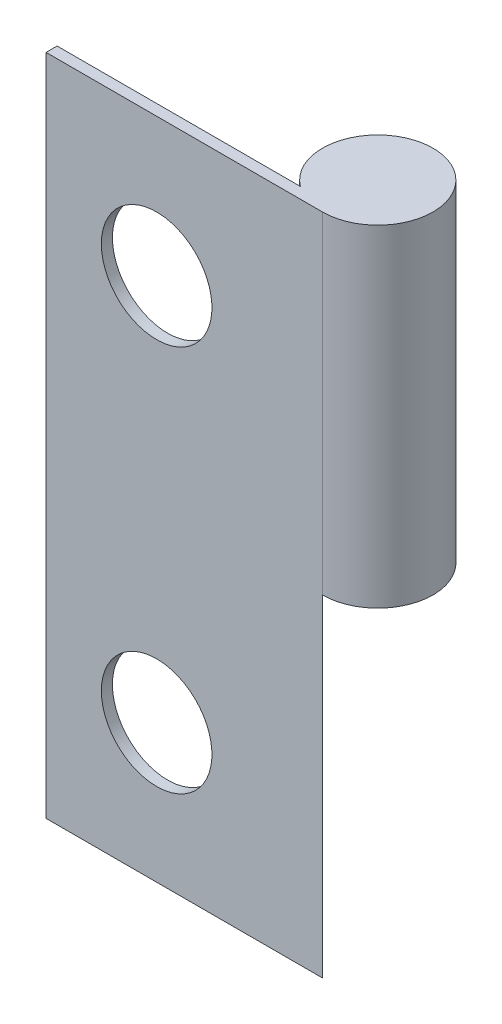
ISO-10303-21;
HEADER;
FILE_DESCRIPTION(('STEP AP214'),'2;1');
FILE_NAME('part.step','',(''),(''),'','','');
FILE_SCHEMA(('AUTOMOTIVE_DESIGN { 1 0 10303 214 1 1 1 1 }'));
ENDSEC;
DATA;
#1=APPLICATION_CONTEXT('core data for automotive mechanical design processes');
#2=APPLICATION_PROTOCOL_DEFINITION('international standard','automotive_design',2000,#1);
#3=PRODUCT_CONTEXT('',#1,'mechanical');
#4=PRODUCT('Part','Part','',(#3));
#5=PRODUCT_RELATED_PRODUCT_CATEGORY('part','',(#4));
#6=PRODUCT_DEFINITION_FORMATION('','',#4);
#7=PRODUCT_DEFINITION_CONTEXT('part definition',#1,'design');
#8=PRODUCT_DEFINITION('design','',#6,#7);
#9=PRODUCT_DEFINITION_SHAPE('','',#8);
#10=(LENGTH_UNIT() NAMED_UNIT(*) SI_UNIT(.MILLI.,.METRE.));
#11=(NAMED_UNIT(*) PLANE_ANGLE_UNIT() SI_UNIT($,.RADIAN.));
#12=(NAMED_UNIT(*) SI_UNIT($,.STERADIAN.) SOLID_ANGLE_UNIT());
#13=UNCERTAINTY_MEASURE_WITH_UNIT(LENGTH_MEASURE(1.E-05),#10,'distance_accuracy_value','');
#14=(GEOMETRIC_REPRESENTATION_CONTEXT(3) GLOBAL_UNCERTAINTY_ASSIGNED_CONTEXT((#13)) GLOBAL_UNIT_ASSIGNED_CONTEXT((#10,
#11,#12)) REPRESENTATION_CONTEXT('',''));
#15=CARTESIAN_POINT('',(0.,0.,0.));
#16=DIRECTION('',(0.,0.,1.));
#17=DIRECTION('',(1.,0.,0.));
#18=AXIS2_PLACEMENT_3D('',#15,#16,#17);
#19=CARTESIAN_POINT('',(0.,0.,0.));
#20=DIRECTION('',(0.,1.,0.));
#21=DIRECTION('',(0.,0.,1.));
#22=AXIS2_PLACEMENT_3D('',#19,#20,#21);
#23=PLANE('',#22);
#24=CARTESIAN_POINT('',(0.,0.,-1.5875));
#25=DIRECTION('',(0.,1.,0.));
#26=DIRECTION('',(0.,0.,1.));
#27=AXIS2_PLACEMENT_3D('',#24,#25,#26);
#28=CIRCLE('',#27,1.5875);
#29=CARTESIAN_POINT('',(0.,0.,0.));
#30=VERTEX_POINT('',#29);
#31=CARTESIAN_POINT('',(-0.9525,0.,-0.3175));
#32=VERTEX_POINT('',#31);
#33=EDGE_CURVE('E11',#30,#32,#28,.F.);
#34=ORIENTED_EDGE('',*,*,#33,.F.);
#35=DIRECTION('',(-1.,0.,0.));
#36=VECTOR('',#35,1.);
#37=CARTESIAN_POINT('',(0.,0.,0.));
#38=LINE('',#37,#36);
#39=CARTESIAN_POINT('',(-7.9375,0.,0.));
#40=VERTEX_POINT('',#39);
#41=EDGE_CURVE('E105',#30,#40,#38,.T.);
#42=ORIENTED_EDGE('',*,*,#41,.T.);
#43=DIRECTION('',(0.,0.,-1.));
#44=VECTOR('',#43,1.);
#45=CARTESIAN_POINT('',(-7.9375,0.,0.));
#46=LINE('',#45,#44);
#47=CARTESIAN_POINT('',(-7.9375,0.,-0.317499999999999));
#48=VERTEX_POINT('',#47);
#49=EDGE_CURVE('E116',#40,#48,#46,.T.);
#50=ORIENTED_EDGE('',*,*,#49,.T.);
#51=DIRECTION('',(1.,0.,0.));
#52=VECTOR('',#51,1.);
#53=CARTESIAN_POINT('',(0.,0.,-0.3175));
#54=LINE('',#53,#52);
#55=EDGE_CURVE('E120',#48,#32,#54,.T.);
#56=ORIENTED_EDGE('',*,*,#55,.T.);
#57=EDGE_LOOP('',(#34,#42,#50,#56));
#58=FACE_BOUND('',#57,.T.);
#59=ADVANCED_FACE('F39',(#58),#23,.F.);
#60=CARTESIAN_POINT('',(0.,19.05,0.));
#61=DIRECTION('',(0.,0.,1.));
#62=DIRECTION('',(1.,0.,0.));
#63=AXIS2_PLACEMENT_3D('',#60,#61,#62);
#64=PLANE('',#63);
#65=CARTESIAN_POINT('',(-4.7625,15.08125,0.));
#66=DIRECTION('',(0.,0.,-1.));
#67=DIRECTION('',(-1.,0.,0.));
#68=AXIS2_PLACEMENT_3D('',#65,#66,#67);
#69=CIRCLE('',#68,1.5875);
#70=CARTESIAN_POINT('',(-6.35,15.08125,0.));
#71=VERTEX_POINT('',#70);
#72=EDGE_CURVE('E99',#71,#71,#69,.T.);
#73=ORIENTED_EDGE('',*,*,#72,.T.);
#74=EDGE_LOOP('',(#73));
#75=FACE_BOUND('',#74,.T.);
#76=CARTESIAN_POINT('',(-4.7625,3.96875,0.));
#77=DIRECTION('',(0.,0.,-1.));
#78=DIRECTION('',(-1.,0.,0.));
#79=AXIS2_PLACEMENT_3D('',#76,#77,#78);
#80=CIRCLE('',#79,1.5875);
#81=CARTESIAN_POINT('',(-6.35,3.96875,0.));
#82=VERTEX_POINT('',#81);
#83=EDGE_CURVE('E134',#82,#82,#80,.T.);
#84=ORIENTED_EDGE('',*,*,#83,.T.);
#85=EDGE_LOOP('',(#84));
#86=FACE_BOUND('',#85,.T.);
#87=ORIENTED_EDGE('',*,*,#41,.F.);
#88=DIRECTION('',(0.,-1.,0.));
#89=VECTOR('',#88,1.);
#90=CARTESIAN_POINT('',(0.,9.525,0.));
#91=LINE('',#90,#89);
#92=CARTESIAN_POINT('',(0.,9.525,0.));
#93=VERTEX_POINT('',#92);
#94=EDGE_CURVE('E92',#30,#93,#91,.F.);
#95=ORIENTED_EDGE('',*,*,#94,.T.);
#96=DIRECTION('',(0.,-1.,0.));
#97=VECTOR('',#96,1.);
#98=CARTESIAN_POINT('',(0.,19.05,0.));
#99=LINE('',#98,#97);
#100=CARTESIAN_POINT('',(0.,19.05,0.));
#101=VERTEX_POINT('',#100);
#102=EDGE_CURVE('E48',#101,#93,#99,.T.);
#103=ORIENTED_EDGE('',*,*,#102,.F.);
#104=DIRECTION('',(-1.,0.,0.));
#105=VECTOR('',#104,1.);
#106=CARTESIAN_POINT('',(0.,19.05,0.));
#107=LINE('',#106,#105);
#108=CARTESIAN_POINT('',(-7.9375,19.05,0.));
#109=VERTEX_POINT('',#108);
#110=EDGE_CURVE('E119',#101,#109,#107,.T.);
#111=ORIENTED_EDGE('',*,*,#110,.T.);
#112=DIRECTION('',(0.,-1.,0.));
#113=VECTOR('',#112,1.);
#114=CARTESIAN_POINT('',(-7.9375,19.05,0.));
#115=LINE('',#114,#113);
#116=EDGE_CURVE('E56',#109,#40,#115,.T.);
#117=ORIENTED_EDGE('',*,*,#116,.T.);
#118=EDGE_LOOP('',(#87,#95,#103,#111,#117));
#119=FACE_BOUND('',#118,.T.);
#120=ADVANCED_FACE('F41',(#75,#86,#119),#64,.T.);
#121=CARTESIAN_POINT('',(0.,19.05,-1.5875));
#122=DIRECTION('',(0.,-1.,0.));
#123=DIRECTION('',(0.,0.,-1.));
#124=AXIS2_PLACEMENT_3D('',#121,#122,#123);
#125=CYLINDRICAL_SURFACE('',#124,1.5875);
#126=ORIENTED_EDGE('',*,*,#102,.T.);
#127=CARTESIAN_POINT('',(0.,9.525,-1.5875));
#128=DIRECTION('',(0.,1.,0.));
#129=DIRECTION('',(0.,0.,1.));
#130=AXIS2_PLACEMENT_3D('',#127,#128,#129);
#131=CIRCLE('',#130,1.5875);
#132=CARTESIAN_POINT('',(-0.9525,9.525,-0.3175));
#133=VERTEX_POINT('',#132);
#134=EDGE_CURVE('E98',#93,#133,#131,.T.);
#135=ORIENTED_EDGE('',*,*,#134,.T.);
#136=DIRECTION('',(0.,-1.,0.));
#137=VECTOR('',#136,1.);
#138=CARTESIAN_POINT('',(-0.9525,19.05,-0.3175));
#139=LINE('',#138,#137);
#140=CARTESIAN_POINT('',(-0.9525,19.05,-0.3175));
#141=VERTEX_POINT('',#140);
#142=EDGE_CURVE('E110',#141,#133,#139,.T.);
#143=ORIENTED_EDGE('',*,*,#142,.F.);
#144=CARTESIAN_POINT('',(0.,19.05,-1.5875));
#145=DIRECTION('',(0.,1.,0.));
#146=DIRECTION('',(0.,0.,1.));
#147=AXIS2_PLACEMENT_3D('',#144,#145,#146);
#148=CIRCLE('',#147,1.5875);
#149=EDGE_CURVE('E108',#101,#141,#148,.T.);
#150=ORIENTED_EDGE('',*,*,#149,.F.);
#151=EDGE_LOOP('',(#126,#135,#143,#150));
#152=FACE_BOUND('',#151,.T.);
#153=ADVANCED_FACE('F107',(#152),#125,.T.);
#154=CARTESIAN_POINT('',(0.,19.05,-0.3175));
#155=DIRECTION('',(0.,0.,-1.));
#156=DIRECTION('',(-1.,0.,0.));
#157=AXIS2_PLACEMENT_3D('',#154,#155,#156);
#158=PLANE('',#157);
#159=CARTESIAN_POINT('',(-4.7625,15.08125,-0.3175));
#160=DIRECTION('',(0.,0.,-1.));
#161=DIRECTION('',(-1.,0.,0.));
#162=AXIS2_PLACEMENT_3D('',#159,#160,#161);
#163=CIRCLE('',#162,1.5875);
#164=CARTESIAN_POINT('',(-6.35,15.08125,-0.317499999999999));
#165=VERTEX_POINT('',#164);
#166=EDGE_CURVE('E137',#165,#165,#163,.T.);
#167=ORIENTED_EDGE('',*,*,#166,.F.);
#168=EDGE_LOOP('',(#167));
#169=FACE_BOUND('',#168,.T.);
#170=CARTESIAN_POINT('',(-4.7625,3.96875,-0.3175));
#171=DIRECTION('',(0.,0.,-1.));
#172=DIRECTION('',(-1.,0.,0.));
#173=AXIS2_PLACEMENT_3D('',#170,#171,#172);
#174=CIRCLE('',#173,1.5875);
#175=CARTESIAN_POINT('',(-6.35,3.96875,-0.317499999999999));
#176=VERTEX_POINT('',#175);
#177=EDGE_CURVE('E131',#176,#176,#174,.T.);
#178=ORIENTED_EDGE('',*,*,#177,.F.);
#179=EDGE_LOOP('',(#178));
#180=FACE_BOUND('',#179,.T.);
#181=ORIENTED_EDGE('',*,*,#55,.F.);
#182=DIRECTION('',(0.,-1.,0.));
#183=VECTOR('',#182,1.);
#184=CARTESIAN_POINT('',(-7.9375,19.05,-0.317499999999999));
#185=LINE('',#184,#183);
#186=CARTESIAN_POINT('',(-7.9375,19.05,-0.317499999999999));
#187=VERTEX_POINT('',#186);
#188=EDGE_CURVE('E68',#187,#48,#185,.T.);
#189=ORIENTED_EDGE('',*,*,#188,.F.);
#190=DIRECTION('',(1.,0.,0.));
#191=VECTOR('',#190,1.);
#192=CARTESIAN_POINT('',(0.,19.05,-0.3175));
#193=LINE('',#192,#191);
#194=EDGE_CURVE('E125',#187,#141,#193,.T.);
#195=ORIENTED_EDGE('',*,*,#194,.T.);
#196=ORIENTED_EDGE('',*,*,#142,.T.);
#197=DIRECTION('',(0.,-1.,0.));
#198=VECTOR('',#197,1.);
#199=CARTESIAN_POINT('',(-0.952500000000001,9.525,-0.3175));
#200=LINE('',#199,#198);
#201=EDGE_CURVE('E95',#133,#32,#200,.T.);
#202=ORIENTED_EDGE('',*,*,#201,.T.);
#203=EDGE_LOOP('',(#181,#189,#195,#196,#202));
#204=FACE_BOUND('',#203,.T.);
#205=ADVANCED_FACE('F152',(#169,#180,#204),#158,.T.);
#206=CARTESIAN_POINT('',(-7.9375,19.05,0.));
#207=DIRECTION('',(-1.,0.,0.));
#208=DIRECTION('',(0.,0.,1.));
#209=AXIS2_PLACEMENT_3D('',#206,#207,#208);
#210=PLANE('',#209);
#211=ORIENTED_EDGE('',*,*,#49,.F.);
#212=ORIENTED_EDGE('',*,*,#116,.F.);
#213=DIRECTION('',(0.,0.,-1.));
#214=VECTOR('',#213,1.);
#215=CARTESIAN_POINT('',(-7.9375,19.05,0.));
#216=LINE('',#215,#214);
#217=EDGE_CURVE('E115',#109,#187,#216,.T.);
#218=ORIENTED_EDGE('',*,*,#217,.T.);
#219=ORIENTED_EDGE('',*,*,#188,.T.);
#220=EDGE_LOOP('',(#211,#212,#218,#219));
#221=FACE_BOUND('',#220,.T.);
#222=ADVANCED_FACE('F155',(#221),#210,.T.);
#223=CARTESIAN_POINT('',(0.,19.05,0.));
#224=DIRECTION('',(0.,1.,0.));
#225=DIRECTION('',(0.,0.,1.));
#226=AXIS2_PLACEMENT_3D('',#223,#224,#225);
#227=PLANE('',#226);
#228=ORIENTED_EDGE('',*,*,#110,.F.);
#229=ORIENTED_EDGE('',*,*,#149,.T.);
#230=ORIENTED_EDGE('',*,*,#194,.F.);
#231=ORIENTED_EDGE('',*,*,#217,.F.);
#232=EDGE_LOOP('',(#228,#229,#230,#231));
#233=FACE_BOUND('',#232,.T.);
#234=ADVANCED_FACE('F162',(#233),#227,.T.);
#235=CARTESIAN_POINT('',(0.,9.525,-1.5875));
#236=DIRECTION('',(0.,-1.,0.));
#237=DIRECTION('',(0.,0.,-1.));
#238=AXIS2_PLACEMENT_3D('',#235,#236,#237);
#239=CYLINDRICAL_SURFACE('',#238,1.5875);
#240=ORIENTED_EDGE('',*,*,#33,.T.);
#241=ORIENTED_EDGE('',*,*,#201,.F.);
#242=EDGE_CURVE('E89',#133,#93,#131,.T.);
#243=ORIENTED_EDGE('',*,*,#242,.T.);
#244=ORIENTED_EDGE('',*,*,#94,.F.);
#245=EDGE_LOOP('',(#240,#241,#243,#244));
#246=FACE_BOUND('',#245,.T.);
#247=ADVANCED_FACE('F91',(#246),#239,.F.);
#248=CARTESIAN_POINT('',(0.,9.525,0.));
#249=DIRECTION('',(0.,1.,0.));
#250=DIRECTION('',(0.,0.,1.));
#251=AXIS2_PLACEMENT_3D('',#248,#249,#250);
#252=PLANE('',#251);
#253=ORIENTED_EDGE('',*,*,#134,.F.);
#254=ORIENTED_EDGE('',*,*,#242,.F.);
#255=EDGE_LOOP('',(#253,#254));
#256=FACE_BOUND('',#255,.T.);
#257=ADVANCED_FACE('F101',(#256),#252,.F.);
#258=CARTESIAN_POINT('',(-4.7625,3.96875,0.));
#259=DIRECTION('',(0.,0.,-1.));
#260=DIRECTION('',(-1.,0.,0.));
#261=AXIS2_PLACEMENT_3D('',#258,#259,#260);
#262=CYLINDRICAL_SURFACE('',#261,1.5875);
#263=ORIENTED_EDGE('',*,*,#83,.F.);
#264=EDGE_LOOP('',(#263));
#265=FACE_BOUND('',#264,.T.);
#266=ORIENTED_EDGE('',*,*,#177,.T.);
#267=EDGE_LOOP('',(#266));
#268=FACE_BOUND('',#267,.T.);
#269=ADVANCED_FACE('F148',(#265,#268),#262,.F.);
#270=CARTESIAN_POINT('',(-4.7625,15.08125,0.));
#271=DIRECTION('',(0.,0.,-1.));
#272=DIRECTION('',(-1.,0.,0.));
#273=AXIS2_PLACEMENT_3D('',#270,#271,#272);
#274=CYLINDRICAL_SURFACE('',#273,1.5875);
#275=ORIENTED_EDGE('',*,*,#72,.F.);
#276=EDGE_LOOP('',(#275));
#277=FACE_BOUND('',#276,.T.);
#278=ORIENTED_EDGE('',*,*,#166,.T.);
#279=EDGE_LOOP('',(#278));
#280=FACE_BOUND('',#279,.T.);
#281=ADVANCED_FACE('F145',(#277,#280),#274,.F.);
#282=CLOSED_SHELL('',(#59,#120,#153,#205,#222,#234,#247,#257,#269,#281));
#283=MANIFOLD_SOLID_BREP('B2',#282);
#284=ADVANCED_BREP_SHAPE_REPRESENTATION('',(#18,#283),#14);
#285=SHAPE_DEFINITION_REPRESENTATION(#9,#284);
ENDSEC;
END-ISO-10303-21;
